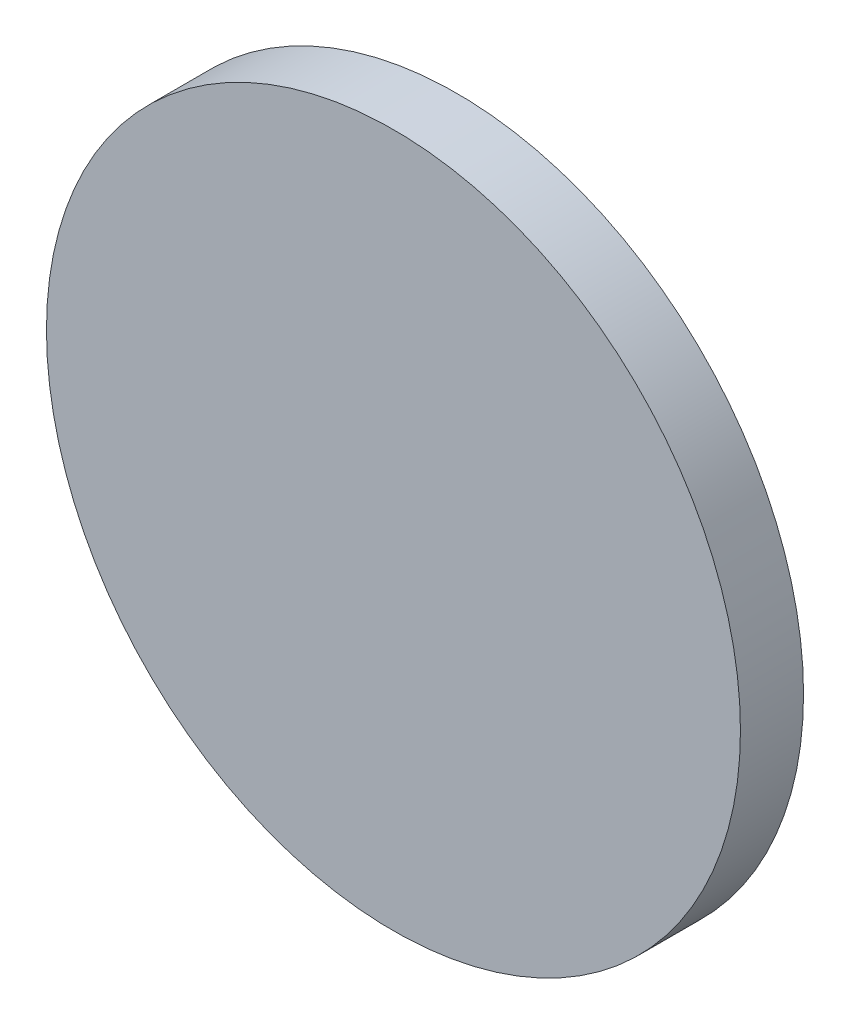
ISO-10303-21;
HEADER;
FILE_DESCRIPTION(('STEP AP214'),'2;1');
FILE_NAME('part.step','',(''),(''),'','','');
FILE_SCHEMA(('AUTOMOTIVE_DESIGN { 1 0 10303 214 1 1 1 1 }'));
ENDSEC;
DATA;
#1=APPLICATION_CONTEXT('core data for automotive mechanical design processes');
#2=APPLICATION_PROTOCOL_DEFINITION('international standard','automotive_design',2000,#1);
#3=PRODUCT_CONTEXT('',#1,'mechanical');
#4=PRODUCT('Part','Part','',(#3));
#5=PRODUCT_RELATED_PRODUCT_CATEGORY('part','',(#4));
#6=PRODUCT_DEFINITION_FORMATION('','',#4);
#7=PRODUCT_DEFINITION_CONTEXT('part definition',#1,'design');
#8=PRODUCT_DEFINITION('design','',#6,#7);
#9=PRODUCT_DEFINITION_SHAPE('','',#8);
#10=(LENGTH_UNIT() NAMED_UNIT(*) SI_UNIT(.MILLI.,.METRE.));
#11=(NAMED_UNIT(*) PLANE_ANGLE_UNIT() SI_UNIT($,.RADIAN.));
#12=(NAMED_UNIT(*) SI_UNIT($,.STERADIAN.) SOLID_ANGLE_UNIT());
#13=UNCERTAINTY_MEASURE_WITH_UNIT(LENGTH_MEASURE(1.E-05),#10,'distance_accuracy_value','');
#14=(GEOMETRIC_REPRESENTATION_CONTEXT(3) GLOBAL_UNCERTAINTY_ASSIGNED_CONTEXT((#13)) GLOBAL_UNIT_ASSIGNED_CONTEXT((#10,
#11,#12)) REPRESENTATION_CONTEXT('',''));
#15=CARTESIAN_POINT('',(0.,0.,0.));
#16=DIRECTION('',(0.,0.,1.));
#17=DIRECTION('',(1.,0.,0.));
#18=AXIS2_PLACEMENT_3D('',#15,#16,#17);
#19=CARTESIAN_POINT('',(0.,0.,2.));
#20=DIRECTION('',(0.,0.,-1.));
#21=DIRECTION('',(-1.,0.,0.));
#22=AXIS2_PLACEMENT_3D('',#19,#20,#21);
#23=CYLINDRICAL_SURFACE('',#22,11.);
#24=CARTESIAN_POINT('',(0.,0.,2.));
#25=DIRECTION('',(0.,0.,1.));
#26=DIRECTION('',(1.,0.,0.));
#27=AXIS2_PLACEMENT_3D('',#24,#25,#26);
#28=CIRCLE('',#27,11.);
#29=CARTESIAN_POINT('',(11.,0.,2.));
#30=VERTEX_POINT('',#29);
#31=EDGE_CURVE('E10',#30,#30,#28,.T.);
#32=ORIENTED_EDGE('',*,*,#31,.F.);
#33=EDGE_LOOP('',(#32));
#34=FACE_BOUND('',#33,.T.);
#35=CARTESIAN_POINT('',(0.,0.,0.));
#36=DIRECTION('',(0.,0.,1.));
#37=DIRECTION('',(1.,0.,0.));
#38=AXIS2_PLACEMENT_3D('',#35,#36,#37);
#39=CIRCLE('',#38,11.);
#40=CARTESIAN_POINT('',(11.,0.,0.));
#41=VERTEX_POINT('',#40);
#42=EDGE_CURVE('E28',#41,#41,#39,.T.);
#43=ORIENTED_EDGE('',*,*,#42,.T.);
#44=EDGE_LOOP('',(#43));
#45=FACE_BOUND('',#44,.T.);
#46=ADVANCED_FACE('F25',(#34,#45),#23,.T.);
#47=CARTESIAN_POINT('',(0.,0.,2.));
#48=DIRECTION('',(0.,0.,1.));
#49=DIRECTION('',(1.,0.,0.));
#50=AXIS2_PLACEMENT_3D('',#47,#48,#49);
#51=PLANE('',#50);
#52=ORIENTED_EDGE('',*,*,#31,.T.);
#53=EDGE_LOOP('',(#52));
#54=FACE_BOUND('',#53,.T.);
#55=ADVANCED_FACE('F40',(#54),#51,.T.);
#56=CARTESIAN_POINT('',(0.,0.,0.));
#57=DIRECTION('',(0.,0.,1.));
#58=DIRECTION('',(1.,0.,0.));
#59=AXIS2_PLACEMENT_3D('',#56,#57,#58);
#60=PLANE('',#59);
#61=ORIENTED_EDGE('',*,*,#42,.F.);
#62=EDGE_LOOP('',(#61));
#63=FACE_BOUND('',#62,.T.);
#64=ADVANCED_FACE('F38',(#63),#60,.F.);
#65=CLOSED_SHELL('',(#46,#55,#64));
#66=MANIFOLD_SOLID_BREP('B2',#65);
#67=ADVANCED_BREP_SHAPE_REPRESENTATION('',(#18,#66),#14);
#68=SHAPE_DEFINITION_REPRESENTATION(#9,#67);
ENDSEC;
END-ISO-10303-21;
